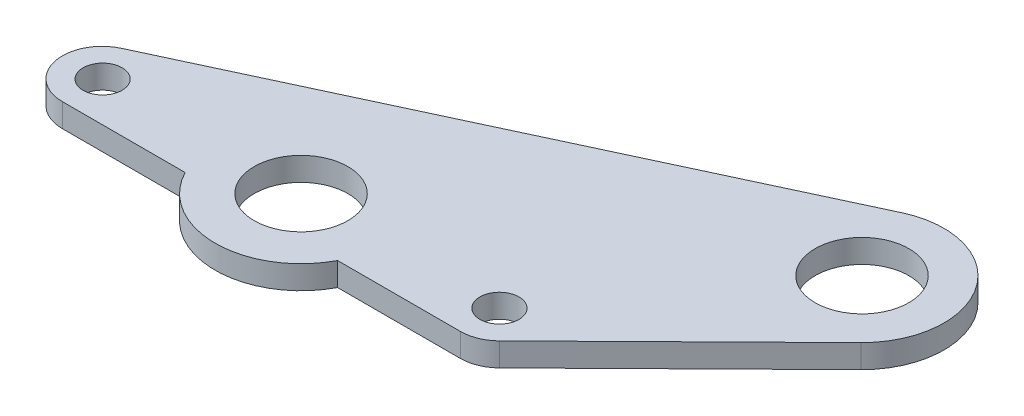
ISO-10303-21;
HEADER;
FILE_DESCRIPTION(('STEP AP214'),'2;1');
FILE_NAME('part.step','',(''),(''),'','','');
FILE_SCHEMA(('AUTOMOTIVE_DESIGN { 1 0 10303 214 1 1 1 1 }'));
ENDSEC;
DATA;
#1=APPLICATION_CONTEXT('core data for automotive mechanical design processes');
#2=APPLICATION_PROTOCOL_DEFINITION('international standard','automotive_design',2000,#1);
#3=PRODUCT_CONTEXT('',#1,'mechanical');
#4=PRODUCT('Part','Part','',(#3));
#5=PRODUCT_RELATED_PRODUCT_CATEGORY('part','',(#4));
#6=PRODUCT_DEFINITION_FORMATION('','',#4);
#7=PRODUCT_DEFINITION_CONTEXT('part definition',#1,'design');
#8=PRODUCT_DEFINITION('design','',#6,#7);
#9=PRODUCT_DEFINITION_SHAPE('','',#8);
#10=(LENGTH_UNIT() NAMED_UNIT(*) SI_UNIT(.MILLI.,.METRE.));
#11=(NAMED_UNIT(*) PLANE_ANGLE_UNIT() SI_UNIT($,.RADIAN.));
#12=(NAMED_UNIT(*) SI_UNIT($,.STERADIAN.) SOLID_ANGLE_UNIT());
#13=UNCERTAINTY_MEASURE_WITH_UNIT(LENGTH_MEASURE(1.E-05),#10,'distance_accuracy_value','');
#14=(GEOMETRIC_REPRESENTATION_CONTEXT(3) GLOBAL_UNCERTAINTY_ASSIGNED_CONTEXT((#13)) GLOBAL_UNIT_ASSIGNED_CONTEXT((#10,
#11,#12)) REPRESENTATION_CONTEXT('',''));
#15=CARTESIAN_POINT('',(0.,0.,0.));
#16=DIRECTION('',(0.,0.,1.));
#17=DIRECTION('',(1.,0.,0.));
#18=AXIS2_PLACEMENT_3D('',#15,#16,#17);
#19=CARTESIAN_POINT('',(25.47,3.,0.));
#20=DIRECTION('',(0.,1.,0.));
#21=DIRECTION('',(0.,0.,1.));
#22=AXIS2_PLACEMENT_3D('',#19,#20,#21);
#23=PLANE('',#22);
#24=CARTESIAN_POINT('',(25.4,3.,0.));
#25=DIRECTION('',(0.,1.,0.));
#26=DIRECTION('',(0.,0.,1.));
#27=AXIS2_PLACEMENT_3D('',#24,#25,#26);
#28=CIRCLE('',#27,2.5);
#29=CARTESIAN_POINT('',(25.4,3.,2.49999999999999));
#30=VERTEX_POINT('',#29);
#31=EDGE_CURVE('E227',#30,#30,#28,.T.);
#32=ORIENTED_EDGE('',*,*,#31,.F.);
#33=EDGE_LOOP('',(#32));
#34=FACE_BOUND('',#33,.T.);
#35=CARTESIAN_POINT('',(45.,3.,-26.8079701609737));
#36=DIRECTION('',(0.,1.,0.));
#37=DIRECTION('',(0.,0.,1.));
#38=AXIS2_PLACEMENT_3D('',#35,#36,#37);
#39=CIRCLE('',#38,6.);
#40=CARTESIAN_POINT('',(45.,3.,-20.8079701609737));
#41=VERTEX_POINT('',#40);
#42=EDGE_CURVE('E152',#41,#41,#39,.T.);
#43=ORIENTED_EDGE('',*,*,#42,.F.);
#44=EDGE_LOOP('',(#43));
#45=FACE_BOUND('',#44,.T.);
#46=CARTESIAN_POINT('',(25.47,3.,0.));
#47=DIRECTION('',(0.,1.,0.));
#48=DIRECTION('',(0.,0.,1.));
#49=AXIS2_PLACEMENT_3D('',#46,#47,#48);
#50=CIRCLE('',#49,5.07999999999999);
#51=CARTESIAN_POINT('',(25.47,3.,5.08));
#52=VERTEX_POINT('',#51);
#53=CARTESIAN_POINT('',(29.0319519343451,3.,3.62200199025557));
#54=VERTEX_POINT('',#53);
#55=EDGE_CURVE('E170',#52,#54,#50,.T.);
#56=ORIENTED_EDGE('',*,*,#55,.T.);
#57=DIRECTION('',(0.712992517766848,0.,-0.701171640619107));
#58=VECTOR('',#57,1.);
#59=CARTESIAN_POINT('',(29.0319519343451,3.,3.62200199025557));
#60=LINE('',#59,#58);
#61=CARTESIAN_POINT('',(52.3623022265006,3.,-19.3215487244218));
#62=VERTEX_POINT('',#61);
#63=EDGE_CURVE('E106',#54,#62,#60,.T.);
#64=ORIENTED_EDGE('',*,*,#63,.T.);
#65=CARTESIAN_POINT('',(45.,3.,-26.8079701609737));
#66=DIRECTION('',(0.,1.,0.));
#67=DIRECTION('',(0.,0.,1.));
#68=AXIS2_PLACEMENT_3D('',#65,#66,#67);
#69=CIRCLE('',#68,10.5);
#70=CARTESIAN_POINT('',(40.5708160534453,3.,-36.3280715032695));
#71=VERTEX_POINT('',#70);
#72=EDGE_CURVE('E191',#62,#71,#69,.T.);
#73=ORIENTED_EDGE('',*,*,#72,.T.);
#74=DIRECTION('',(-0.906676318313884,0.,0.421827042529021));
#75=VECTOR('',#74,1.);
#76=CARTESIAN_POINT('',(-27.6128813760474,3.,-4.60591569703452));
#77=LINE('',#76,#75);
#78=CARTESIAN_POINT('',(-27.6128813760474,3.,-4.60591569703453));
#79=VERTEX_POINT('',#78);
#80=EDGE_CURVE('E205',#71,#79,#77,.T.);
#81=ORIENTED_EDGE('',*,*,#80,.T.);
#82=CARTESIAN_POINT('',(-25.47,3.,0.));
#83=DIRECTION('',(0.,1.,0.));
#84=DIRECTION('',(0.,0.,-1.));
#85=AXIS2_PLACEMENT_3D('',#82,#83,#84);
#86=CIRCLE('',#85,5.08);
#87=CARTESIAN_POINT('',(-25.47,3.,5.08000000000001));
#88=VERTEX_POINT('',#87);
#89=EDGE_CURVE('E125',#79,#88,#86,.T.);
#90=ORIENTED_EDGE('',*,*,#89,.T.);
#91=DIRECTION('',(1.,0.,0.));
#92=VECTOR('',#91,1.);
#93=CARTESIAN_POINT('',(-9.75672076058344,3.,5.08000000000001));
#94=LINE('',#93,#92);
#95=CARTESIAN_POINT('',(-9.75672076058344,3.,5.08000000000001));
#96=VERTEX_POINT('',#95);
#97=EDGE_CURVE('E119',#88,#96,#94,.T.);
#98=ORIENTED_EDGE('',*,*,#97,.T.);
#99=CARTESIAN_POINT('',(0.,3.,0.));
#100=DIRECTION('',(0.,1.,0.));
#101=DIRECTION('',(0.,0.,1.));
#102=AXIS2_PLACEMENT_3D('',#99,#100,#101);
#103=CIRCLE('',#102,11.);
#104=CARTESIAN_POINT('',(9.75672076058344,3.,5.08));
#105=VERTEX_POINT('',#104);
#106=EDGE_CURVE('E123',#96,#105,#103,.T.);
#107=ORIENTED_EDGE('',*,*,#106,.T.);
#108=DIRECTION('',(1.,0.,0.));
#109=VECTOR('',#108,1.);
#110=CARTESIAN_POINT('',(25.47,3.,5.08));
#111=LINE('',#110,#109);
#112=EDGE_CURVE('E63',#105,#52,#111,.T.);
#113=ORIENTED_EDGE('',*,*,#112,.T.);
#114=EDGE_LOOP('',(#56,#64,#73,#81,#90,#98,#107,#113));
#115=FACE_BOUND('',#114,.T.);
#116=CARTESIAN_POINT('',(0.,3.,0.));
#117=DIRECTION('',(0.,1.,0.));
#118=DIRECTION('',(0.,0.,1.));
#119=AXIS2_PLACEMENT_3D('',#116,#117,#118);
#120=CIRCLE('',#119,6.);
#121=CARTESIAN_POINT('',(0.,3.,6.));
#122=VERTEX_POINT('',#121);
#123=EDGE_CURVE('E219',#122,#122,#120,.T.);
#124=ORIENTED_EDGE('',*,*,#123,.F.);
#125=EDGE_LOOP('',(#124));
#126=FACE_BOUND('',#125,.T.);
#127=CARTESIAN_POINT('',(-25.4,3.,0.));
#128=DIRECTION('',(0.,1.,0.));
#129=DIRECTION('',(0.,0.,1.));
#130=AXIS2_PLACEMENT_3D('',#127,#128,#129);
#131=CIRCLE('',#130,2.5);
#132=CARTESIAN_POINT('',(-25.4,3.,2.50000000000001));
#133=VERTEX_POINT('',#132);
#134=EDGE_CURVE('E235',#133,#133,#131,.T.);
#135=ORIENTED_EDGE('',*,*,#134,.F.);
#136=EDGE_LOOP('',(#135));
#137=FACE_BOUND('',#136,.T.);
#138=ADVANCED_FACE('F45',(#34,#45,#115,#126,#137),#23,.T.);
#139=CARTESIAN_POINT('',(25.47,0.,0.));
#140=DIRECTION('',(0.,1.,0.));
#141=DIRECTION('',(0.,0.,1.));
#142=AXIS2_PLACEMENT_3D('',#139,#140,#141);
#143=PLANE('',#142);
#144=CARTESIAN_POINT('',(25.47,0.,0.));
#145=DIRECTION('',(0.,1.,0.));
#146=DIRECTION('',(0.,0.,1.));
#147=AXIS2_PLACEMENT_3D('',#144,#145,#146);
#148=CIRCLE('',#147,5.07999999999999);
#149=CARTESIAN_POINT('',(25.47,0.,5.08));
#150=VERTEX_POINT('',#149);
#151=CARTESIAN_POINT('',(29.0319519343451,0.,3.62200199025557));
#152=VERTEX_POINT('',#151);
#153=EDGE_CURVE('E147',#150,#152,#148,.T.);
#154=ORIENTED_EDGE('',*,*,#153,.F.);
#155=DIRECTION('',(1.,0.,0.));
#156=VECTOR('',#155,1.);
#157=CARTESIAN_POINT('',(25.47,0.,5.08));
#158=LINE('',#157,#156);
#159=CARTESIAN_POINT('',(9.75672076058344,0.,5.08));
#160=VERTEX_POINT('',#159);
#161=EDGE_CURVE('E98',#160,#150,#158,.T.);
#162=ORIENTED_EDGE('',*,*,#161,.F.);
#163=CARTESIAN_POINT('',(0.,0.,0.));
#164=DIRECTION('',(0.,1.,0.));
#165=DIRECTION('',(0.,0.,1.));
#166=AXIS2_PLACEMENT_3D('',#163,#164,#165);
#167=CIRCLE('',#166,11.);
#168=CARTESIAN_POINT('',(-9.75672076058344,0.,5.08000000000001));
#169=VERTEX_POINT('',#168);
#170=EDGE_CURVE('E92',#169,#160,#167,.T.);
#171=ORIENTED_EDGE('',*,*,#170,.F.);
#172=DIRECTION('',(1.,0.,0.));
#173=VECTOR('',#172,1.);
#174=CARTESIAN_POINT('',(-9.75672076058344,0.,5.08000000000001));
#175=LINE('',#174,#173);
#176=CARTESIAN_POINT('',(-25.47,0.,5.08000000000001));
#177=VERTEX_POINT('',#176);
#178=EDGE_CURVE('E134',#177,#169,#175,.T.);
#179=ORIENTED_EDGE('',*,*,#178,.F.);
#180=CARTESIAN_POINT('',(-25.47,0.,0.));
#181=DIRECTION('',(0.,1.,0.));
#182=DIRECTION('',(0.,0.,-1.));
#183=AXIS2_PLACEMENT_3D('',#180,#181,#182);
#184=CIRCLE('',#183,5.08);
#185=CARTESIAN_POINT('',(-27.6128813760474,0.,-4.60591569703453));
#186=VERTEX_POINT('',#185);
#187=EDGE_CURVE('E161',#186,#177,#184,.T.);
#188=ORIENTED_EDGE('',*,*,#187,.F.);
#189=DIRECTION('',(-0.906676318313884,0.,0.421827042529021));
#190=VECTOR('',#189,1.);
#191=CARTESIAN_POINT('',(-27.6128813760474,0.,-4.60591569703452));
#192=LINE('',#191,#190);
#193=CARTESIAN_POINT('',(40.5708160534453,0.,-36.3280715032695));
#194=VERTEX_POINT('',#193);
#195=EDGE_CURVE('E158',#194,#186,#192,.T.);
#196=ORIENTED_EDGE('',*,*,#195,.F.);
#197=CARTESIAN_POINT('',(45.,0.,-26.8079701609737));
#198=DIRECTION('',(0.,1.,0.));
#199=DIRECTION('',(0.,0.,1.));
#200=AXIS2_PLACEMENT_3D('',#197,#198,#199);
#201=CIRCLE('',#200,10.5);
#202=CARTESIAN_POINT('',(52.3623022265006,0.,-19.3215487244218));
#203=VERTEX_POINT('',#202);
#204=EDGE_CURVE('E155',#203,#194,#201,.T.);
#205=ORIENTED_EDGE('',*,*,#204,.F.);
#206=DIRECTION('',(0.712992517766848,0.,-0.701171640619107));
#207=VECTOR('',#206,1.);
#208=CARTESIAN_POINT('',(29.0319519343451,0.,3.62200199025557));
#209=LINE('',#208,#207);
#210=EDGE_CURVE('E151',#152,#203,#209,.T.);
#211=ORIENTED_EDGE('',*,*,#210,.F.);
#212=EDGE_LOOP('',(#154,#162,#171,#179,#188,#196,#205,#211));
#213=FACE_BOUND('',#212,.T.);
#214=CARTESIAN_POINT('',(45.,0.,-26.8079701609737));
#215=DIRECTION('',(0.,1.,0.));
#216=DIRECTION('',(0.,0.,1.));
#217=AXIS2_PLACEMENT_3D('',#214,#215,#216);
#218=CIRCLE('',#217,6.);
#219=CARTESIAN_POINT('',(45.,0.,-20.8079701609737));
#220=VERTEX_POINT('',#219);
#221=EDGE_CURVE('E215',#220,#220,#218,.T.);
#222=ORIENTED_EDGE('',*,*,#221,.T.);
#223=EDGE_LOOP('',(#222));
#224=FACE_BOUND('',#223,.T.);
#225=CARTESIAN_POINT('',(0.,0.,0.));
#226=DIRECTION('',(0.,1.,0.));
#227=DIRECTION('',(0.,0.,1.));
#228=AXIS2_PLACEMENT_3D('',#225,#226,#227);
#229=CIRCLE('',#228,6.);
#230=CARTESIAN_POINT('',(0.,0.,6.));
#231=VERTEX_POINT('',#230);
#232=EDGE_CURVE('E223',#231,#231,#229,.T.);
#233=ORIENTED_EDGE('',*,*,#232,.T.);
#234=EDGE_LOOP('',(#233));
#235=FACE_BOUND('',#234,.T.);
#236=CARTESIAN_POINT('',(25.4,0.,0.));
#237=DIRECTION('',(0.,1.,0.));
#238=DIRECTION('',(0.,0.,1.));
#239=AXIS2_PLACEMENT_3D('',#236,#237,#238);
#240=CIRCLE('',#239,2.5);
#241=CARTESIAN_POINT('',(25.4,0.,2.49999999999999));
#242=VERTEX_POINT('',#241);
#243=EDGE_CURVE('E231',#242,#242,#240,.T.);
#244=ORIENTED_EDGE('',*,*,#243,.T.);
#245=EDGE_LOOP('',(#244));
#246=FACE_BOUND('',#245,.T.);
#247=CARTESIAN_POINT('',(-25.4,0.,0.));
#248=DIRECTION('',(0.,1.,0.));
#249=DIRECTION('',(0.,0.,1.));
#250=AXIS2_PLACEMENT_3D('',#247,#248,#249);
#251=CIRCLE('',#250,2.5);
#252=CARTESIAN_POINT('',(-25.4,0.,2.50000000000001));
#253=VERTEX_POINT('',#252);
#254=EDGE_CURVE('E239',#253,#253,#251,.T.);
#255=ORIENTED_EDGE('',*,*,#254,.T.);
#256=EDGE_LOOP('',(#255));
#257=FACE_BOUND('',#256,.T.);
#258=ADVANCED_FACE('F195',(#213,#224,#235,#246,#257),#143,.F.);
#259=CARTESIAN_POINT('',(25.47,3.,0.));
#260=DIRECTION('',(0.,-1.,0.));
#261=DIRECTION('',(0.,0.,-1.));
#262=AXIS2_PLACEMENT_3D('',#259,#260,#261);
#263=CYLINDRICAL_SURFACE('',#262,5.07999999999999);
#264=ORIENTED_EDGE('',*,*,#153,.T.);
#265=DIRECTION('',(0.,-1.,0.));
#266=VECTOR('',#265,1.);
#267=CARTESIAN_POINT('',(29.0319519343451,3.,3.62200199025557));
#268=LINE('',#267,#266);
#269=EDGE_CURVE('E11',#54,#152,#268,.T.);
#270=ORIENTED_EDGE('',*,*,#269,.F.);
#271=ORIENTED_EDGE('',*,*,#55,.F.);
#272=DIRECTION('',(0.,-1.,0.));
#273=VECTOR('',#272,1.);
#274=CARTESIAN_POINT('',(25.47,3.,5.08));
#275=LINE('',#274,#273);
#276=EDGE_CURVE('E143',#52,#150,#275,.T.);
#277=ORIENTED_EDGE('',*,*,#276,.T.);
#278=EDGE_LOOP('',(#264,#270,#271,#277));
#279=FACE_BOUND('',#278,.T.);
#280=ADVANCED_FACE('F47',(#279),#263,.T.);
#281=CARTESIAN_POINT('',(29.0319519343451,3.,3.62200199025557));
#282=DIRECTION('',(-0.701171640619107,0.,-0.712992517766849));
#283=DIRECTION('',(-0.712992517766849,0.,0.701171640619107));
#284=AXIS2_PLACEMENT_3D('',#281,#282,#283);
#285=PLANE('',#284);
#286=ORIENTED_EDGE('',*,*,#210,.T.);
#287=DIRECTION('',(0.,-1.,0.));
#288=VECTOR('',#287,1.);
#289=CARTESIAN_POINT('',(52.3623022265006,3.,-19.3215487244218));
#290=LINE('',#289,#288);
#291=EDGE_CURVE('E55',#62,#203,#290,.T.);
#292=ORIENTED_EDGE('',*,*,#291,.F.);
#293=ORIENTED_EDGE('',*,*,#63,.F.);
#294=ORIENTED_EDGE('',*,*,#269,.T.);
#295=EDGE_LOOP('',(#286,#292,#293,#294));
#296=FACE_BOUND('',#295,.T.);
#297=ADVANCED_FACE('F275',(#296),#285,.F.);
#298=CARTESIAN_POINT('',(45.,3.,-26.8079701609737));
#299=DIRECTION('',(0.,-1.,0.));
#300=DIRECTION('',(0.,0.,-1.));
#301=AXIS2_PLACEMENT_3D('',#298,#299,#300);
#302=CYLINDRICAL_SURFACE('',#301,10.5);
#303=ORIENTED_EDGE('',*,*,#204,.T.);
#304=DIRECTION('',(0.,-1.,0.));
#305=VECTOR('',#304,1.);
#306=CARTESIAN_POINT('',(40.5708160534453,3.,-36.3280715032695));
#307=LINE('',#306,#305);
#308=EDGE_CURVE('E181',#71,#194,#307,.T.);
#309=ORIENTED_EDGE('',*,*,#308,.F.);
#310=ORIENTED_EDGE('',*,*,#72,.F.);
#311=ORIENTED_EDGE('',*,*,#291,.T.);
#312=EDGE_LOOP('',(#303,#309,#310,#311));
#313=FACE_BOUND('',#312,.T.);
#314=ADVANCED_FACE('F189',(#313),#302,.T.);
#315=CARTESIAN_POINT('',(-27.6128813760474,3.,-4.60591569703452));
#316=DIRECTION('',(0.421827042529021,0.,0.906676318313884));
#317=DIRECTION('',(0.906676318313884,0.,-0.421827042529021));
#318=AXIS2_PLACEMENT_3D('',#315,#316,#317);
#319=PLANE('',#318);
#320=ORIENTED_EDGE('',*,*,#195,.T.);
#321=DIRECTION('',(0.,-1.,0.));
#322=VECTOR('',#321,1.);
#323=CARTESIAN_POINT('',(-27.6128813760474,3.,-4.60591569703453));
#324=LINE('',#323,#322);
#325=EDGE_CURVE('E177',#79,#186,#324,.T.);
#326=ORIENTED_EDGE('',*,*,#325,.F.);
#327=ORIENTED_EDGE('',*,*,#80,.F.);
#328=ORIENTED_EDGE('',*,*,#308,.T.);
#329=EDGE_LOOP('',(#320,#326,#327,#328));
#330=FACE_BOUND('',#329,.T.);
#331=ADVANCED_FACE('F200',(#330),#319,.F.);
#332=CARTESIAN_POINT('',(-25.47,3.,0.));
#333=DIRECTION('',(0.,-1.,0.));
#334=DIRECTION('',(0.,0.,-1.));
#335=AXIS2_PLACEMENT_3D('',#332,#333,#334);
#336=CYLINDRICAL_SURFACE('',#335,5.08);
#337=ORIENTED_EDGE('',*,*,#187,.T.);
#338=DIRECTION('',(0.,-1.,0.));
#339=VECTOR('',#338,1.);
#340=CARTESIAN_POINT('',(-25.47,3.,5.08000000000001));
#341=LINE('',#340,#339);
#342=EDGE_CURVE('E136',#88,#177,#341,.T.);
#343=ORIENTED_EDGE('',*,*,#342,.F.);
#344=ORIENTED_EDGE('',*,*,#89,.F.);
#345=ORIENTED_EDGE('',*,*,#325,.T.);
#346=EDGE_LOOP('',(#337,#343,#344,#345));
#347=FACE_BOUND('',#346,.T.);
#348=ADVANCED_FACE('F203',(#347),#336,.T.);
#349=CARTESIAN_POINT('',(-9.75672076058344,3.,5.08000000000001));
#350=DIRECTION('',(0.,0.,-1.));
#351=DIRECTION('',(-1.,0.,0.));
#352=AXIS2_PLACEMENT_3D('',#349,#350,#351);
#353=PLANE('',#352);
#354=ORIENTED_EDGE('',*,*,#178,.T.);
#355=DIRECTION('',(0.,-1.,0.));
#356=VECTOR('',#355,1.);
#357=CARTESIAN_POINT('',(-9.75672076058344,3.,5.08000000000001));
#358=LINE('',#357,#356);
#359=EDGE_CURVE('E131',#96,#169,#358,.T.);
#360=ORIENTED_EDGE('',*,*,#359,.F.);
#361=ORIENTED_EDGE('',*,*,#97,.F.);
#362=ORIENTED_EDGE('',*,*,#342,.T.);
#363=EDGE_LOOP('',(#354,#360,#361,#362));
#364=FACE_BOUND('',#363,.T.);
#365=ADVANCED_FACE('F132',(#364),#353,.F.);
#366=CARTESIAN_POINT('',(0.,3.,0.));
#367=DIRECTION('',(0.,-1.,0.));
#368=DIRECTION('',(0.,0.,-1.));
#369=AXIS2_PLACEMENT_3D('',#366,#367,#368);
#370=CYLINDRICAL_SURFACE('',#369,11.);
#371=ORIENTED_EDGE('',*,*,#170,.T.);
#372=DIRECTION('',(0.,-1.,0.));
#373=VECTOR('',#372,1.);
#374=CARTESIAN_POINT('',(9.75672076058344,3.,5.08));
#375=LINE('',#374,#373);
#376=EDGE_CURVE('E137',#105,#160,#375,.T.);
#377=ORIENTED_EDGE('',*,*,#376,.F.);
#378=ORIENTED_EDGE('',*,*,#106,.F.);
#379=ORIENTED_EDGE('',*,*,#359,.T.);
#380=EDGE_LOOP('',(#371,#377,#378,#379));
#381=FACE_BOUND('',#380,.T.);
#382=ADVANCED_FACE('F139',(#381),#370,.T.);
#383=CARTESIAN_POINT('',(25.47,3.,5.08));
#384=DIRECTION('',(0.,0.,-1.));
#385=DIRECTION('',(-1.,0.,0.));
#386=AXIS2_PLACEMENT_3D('',#383,#384,#385);
#387=PLANE('',#386);
#388=ORIENTED_EDGE('',*,*,#161,.T.);
#389=ORIENTED_EDGE('',*,*,#276,.F.);
#390=ORIENTED_EDGE('',*,*,#112,.F.);
#391=ORIENTED_EDGE('',*,*,#376,.T.);
#392=EDGE_LOOP('',(#388,#389,#390,#391));
#393=FACE_BOUND('',#392,.T.);
#394=ADVANCED_FACE('F263',(#393),#387,.F.);
#395=CARTESIAN_POINT('',(45.,3.,-26.8079701609737));
#396=DIRECTION('',(0.,-1.,0.));
#397=DIRECTION('',(0.,0.,-1.));
#398=AXIS2_PLACEMENT_3D('',#395,#396,#397);
#399=CYLINDRICAL_SURFACE('',#398,6.);
#400=ORIENTED_EDGE('',*,*,#42,.T.);
#401=EDGE_LOOP('',(#400));
#402=FACE_BOUND('',#401,.T.);
#403=ORIENTED_EDGE('',*,*,#221,.F.);
#404=EDGE_LOOP('',(#403));
#405=FACE_BOUND('',#404,.T.);
#406=ADVANCED_FACE('F260',(#402,#405),#399,.F.);
#407=CARTESIAN_POINT('',(0.,3.,0.));
#408=DIRECTION('',(0.,-1.,0.));
#409=DIRECTION('',(0.,0.,-1.));
#410=AXIS2_PLACEMENT_3D('',#407,#408,#409);
#411=CYLINDRICAL_SURFACE('',#410,6.);
#412=ORIENTED_EDGE('',*,*,#123,.T.);
#413=EDGE_LOOP('',(#412));
#414=FACE_BOUND('',#413,.T.);
#415=ORIENTED_EDGE('',*,*,#232,.F.);
#416=EDGE_LOOP('',(#415));
#417=FACE_BOUND('',#416,.T.);
#418=ADVANCED_FACE('F338',(#414,#417),#411,.F.);
#419=CARTESIAN_POINT('',(25.4,3.,0.));
#420=DIRECTION('',(0.,-1.,0.));
#421=DIRECTION('',(0.,0.,-1.));
#422=AXIS2_PLACEMENT_3D('',#419,#420,#421);
#423=CYLINDRICAL_SURFACE('',#422,2.5);
#424=ORIENTED_EDGE('',*,*,#31,.T.);
#425=EDGE_LOOP('',(#424));
#426=FACE_BOUND('',#425,.T.);
#427=ORIENTED_EDGE('',*,*,#243,.F.);
#428=EDGE_LOOP('',(#427));
#429=FACE_BOUND('',#428,.T.);
#430=ADVANCED_FACE('F346',(#426,#429),#423,.F.);
#431=CARTESIAN_POINT('',(-25.4,3.,0.));
#432=DIRECTION('',(0.,-1.,0.));
#433=DIRECTION('',(0.,0.,-1.));
#434=AXIS2_PLACEMENT_3D('',#431,#432,#433);
#435=CYLINDRICAL_SURFACE('',#434,2.5);
#436=ORIENTED_EDGE('',*,*,#134,.T.);
#437=EDGE_LOOP('',(#436));
#438=FACE_BOUND('',#437,.T.);
#439=ORIENTED_EDGE('',*,*,#254,.F.);
#440=EDGE_LOOP('',(#439));
#441=FACE_BOUND('',#440,.T.);
#442=ADVANCED_FACE('F247',(#438,#441),#435,.F.);
#443=CLOSED_SHELL('',(#138,#258,#280,#297,#314,#331,#348,#365,#382,#394,#406,#418,#430,#442));
#444=MANIFOLD_SOLID_BREP('B2',#443);
#445=ADVANCED_BREP_SHAPE_REPRESENTATION('',(#18,#444),#14);
#446=SHAPE_DEFINITION_REPRESENTATION(#9,#445);
ENDSEC;
END-ISO-10303-21;
